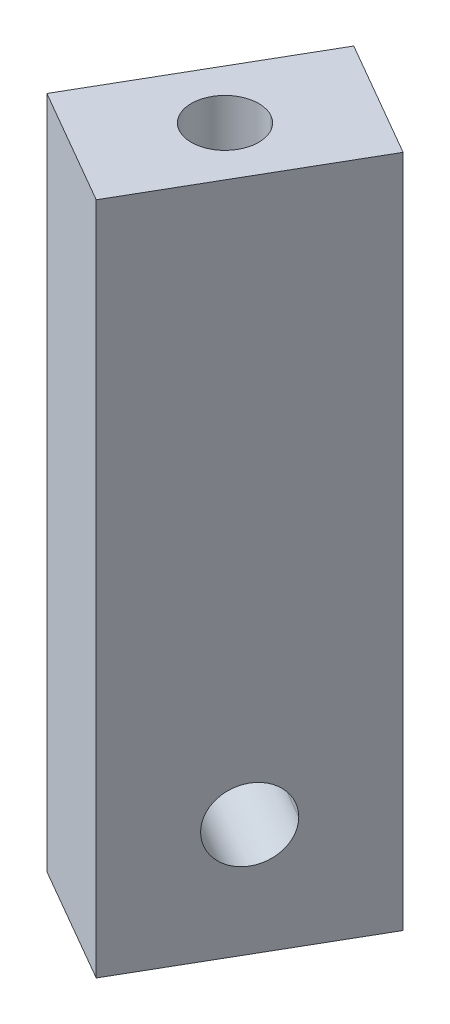
ISO-10303-21;
HEADER;
FILE_DESCRIPTION(('STEP AP214'),'2;1');
FILE_NAME('part.step','',(''),(''),'','','');
FILE_SCHEMA(('AUTOMOTIVE_DESIGN { 1 0 10303 214 1 1 1 1 }'));
ENDSEC;
DATA;
#1=APPLICATION_CONTEXT('core data for automotive mechanical design processes');
#2=APPLICATION_PROTOCOL_DEFINITION('international standard','automotive_design',2000,#1);
#3=PRODUCT_CONTEXT('',#1,'mechanical');
#4=PRODUCT('Part','Part','',(#3));
#5=PRODUCT_RELATED_PRODUCT_CATEGORY('part','',(#4));
#6=PRODUCT_DEFINITION_FORMATION('','',#4);
#7=PRODUCT_DEFINITION_CONTEXT('part definition',#1,'design');
#8=PRODUCT_DEFINITION('design','',#6,#7);
#9=PRODUCT_DEFINITION_SHAPE('','',#8);
#10=(LENGTH_UNIT() NAMED_UNIT(*) SI_UNIT(.MILLI.,.METRE.));
#11=(NAMED_UNIT(*) PLANE_ANGLE_UNIT() SI_UNIT($,.RADIAN.));
#12=(NAMED_UNIT(*) SI_UNIT($,.STERADIAN.) SOLID_ANGLE_UNIT());
#13=UNCERTAINTY_MEASURE_WITH_UNIT(LENGTH_MEASURE(1.E-05),#10,'distance_accuracy_value','');
#14=(GEOMETRIC_REPRESENTATION_CONTEXT(3) GLOBAL_UNCERTAINTY_ASSIGNED_CONTEXT((#13)) GLOBAL_UNIT_ASSIGNED_CONTEXT((#10,
#11,#12)) REPRESENTATION_CONTEXT('',''));
#15=CARTESIAN_POINT('',(0.,0.,0.));
#16=DIRECTION('',(0.,0.,1.));
#17=DIRECTION('',(1.,0.,0.));
#18=AXIS2_PLACEMENT_3D('',#15,#16,#17);
#19=CARTESIAN_POINT('',(-69.9623673877507,376.419245646097,156.984663492636));
#20=DIRECTION('',(0.,1.,0.));
#21=DIRECTION('',(0.866025403784462,0.,0.499999999999959));
#22=AXIS2_PLACEMENT_3D('',#19,#20,#21);
#23=PLANE('',#22);
#24=CARTESIAN_POINT('',(-69.9623673877507,376.419245646097,156.984663492636));
#25=DIRECTION('',(0.,1.,0.));
#26=DIRECTION('',(-0.499999999999959,0.,0.866025403784462));
#27=AXIS2_PLACEMENT_3D('',#24,#25,#26);
#28=CIRCLE('',#27,1.5);
#29=CARTESIAN_POINT('',(-70.7123673877507,376.419245646097,158.283701598313));
#30=VERTEX_POINT('',#29);
#31=CARTESIAN_POINT('',(-69.2123673877508,376.419245646097,155.685625386959));
#32=VERTEX_POINT('',#31);
#33=EDGE_CURVE('E11',#30,#32,#28,.T.);
#34=ORIENTED_EDGE('',*,*,#33,.T.);
#35=CARTESIAN_POINT('',(-69.9623673877507,376.419245646097,156.984663492636));
#36=DIRECTION('',(0.,1.,0.));
#37=DIRECTION('',(-0.499999999999959,0.,0.866025403784462));
#38=AXIS2_PLACEMENT_3D('',#35,#36,#37);
#39=CIRCLE('',#38,1.5);
#40=EDGE_CURVE('E168',#32,#30,#39,.T.);
#41=ORIENTED_EDGE('',*,*,#40,.T.);
#42=EDGE_LOOP('',(#34,#41));
#43=FACE_BOUND('',#42,.T.);
#44=ADVANCED_FACE('F38',(#43),#23,.T.);
#45=CARTESIAN_POINT('',(-69.9623673877507,376.419245646097,156.984663492636));
#46=DIRECTION('',(0.,1.,0.));
#47=DIRECTION('',(-0.499999999999959,0.,0.866025403784462));
#48=AXIS2_PLACEMENT_3D('',#45,#46,#47);
#49=CYLINDRICAL_SURFACE('',#48,1.5);
#50=DIRECTION('',(0.,1.,0.));
#51=VECTOR('',#50,1.);
#52=CARTESIAN_POINT('',(-69.2123673877508,376.419245646097,155.685625386959));
#53=LINE('',#52,#51);
#54=CARTESIAN_POINT('',(-69.212367387751,381.419245646097,155.685625386959));
#55=VERTEX_POINT('',#54);
#56=EDGE_CURVE('E163',#32,#55,#53,.T.);
#57=ORIENTED_EDGE('',*,*,#56,.F.);
#58=ORIENTED_EDGE('',*,*,#33,.F.);
#59=DIRECTION('',(0.,1.,0.));
#60=VECTOR('',#59,1.);
#61=CARTESIAN_POINT('',(-70.7123673877507,376.419245646097,158.283701598313));
#62=LINE('',#61,#60);
#63=CARTESIAN_POINT('',(-70.7123673877508,381.419245646097,158.283701598312));
#64=VERTEX_POINT('',#63);
#65=EDGE_CURVE('E176',#30,#64,#62,.T.);
#66=ORIENTED_EDGE('',*,*,#65,.T.);
#67=CARTESIAN_POINT('',(-69.9623673877509,381.419245646097,156.984663492636));
#68=DIRECTION('',(0.,1.,0.));
#69=DIRECTION('',(-0.499999999999959,0.,0.866025403784462));
#70=AXIS2_PLACEMENT_3D('',#67,#68,#69);
#71=CIRCLE('',#70,1.5);
#72=EDGE_CURVE('E42',#64,#55,#71,.T.);
#73=ORIENTED_EDGE('',*,*,#72,.T.);
#74=EDGE_LOOP('',(#57,#58,#66,#73));
#75=FACE_BOUND('',#74,.T.);
#76=ADVANCED_FACE('F220',(#75),#49,.F.);
#77=CARTESIAN_POINT('',(-67.363425150993,356.419245646097,158.485163492637));
#78=DIRECTION('',(-0.866025403784462,0.,-0.499999999999959));
#79=DIRECTION('',(-0.499999999999959,0.,0.866025403784462));
#80=AXIS2_PLACEMENT_3D('',#77,#78,#79);
#81=CYLINDRICAL_SURFACE('',#80,1.6);
#82=DIRECTION('',(-0.866025403784462,0.,-0.499999999999959));
#83=VECTOR('',#82,1.);
#84=CARTESIAN_POINT('',(-66.563425150993,356.419245646097,157.099522846582));
#85=LINE('',#84,#83);
#86=CARTESIAN_POINT('',(-66.5642911763968,356.419245646097,157.099022846582));
#87=VERTEX_POINT('',#86);
#88=CARTESIAN_POINT('',(-71.7604435991036,356.419245646097,154.099022846583));
#89=VERTEX_POINT('',#88);
#90=EDGE_CURVE('E158',#87,#89,#85,.T.);
#91=ORIENTED_EDGE('',*,*,#90,.F.);
#92=CARTESIAN_POINT('',(-67.3642911763968,356.419245646097,158.484663492637));
#93=DIRECTION('',(0.866025403784462,0.,0.499999999999959));
#94=DIRECTION('',(-0.499999999999959,0.,0.866025403784462));
#95=AXIS2_PLACEMENT_3D('',#92,#93,#94);
#96=CIRCLE('',#95,1.6);
#97=CARTESIAN_POINT('',(-68.1642911763967,356.419245646097,159.870304138693));
#98=VERTEX_POINT('',#97);
#99=EDGE_CURVE('E145',#87,#98,#96,.T.);
#100=ORIENTED_EDGE('',*,*,#99,.T.);
#101=DIRECTION('',(-0.866025403784462,0.,-0.499999999999959));
#102=VECTOR('',#101,1.);
#103=CARTESIAN_POINT('',(-68.1634251509929,356.419245646097,159.870804138693));
#104=LINE('',#103,#102);
#105=CARTESIAN_POINT('',(-73.3604435991035,356.419245646097,156.870304138693));
#106=VERTEX_POINT('',#105);
#107=EDGE_CURVE('E142',#98,#106,#104,.T.);
#108=ORIENTED_EDGE('',*,*,#107,.T.);
#109=CARTESIAN_POINT('',(-72.5604435991035,356.419245646097,155.484663492638));
#110=DIRECTION('',(-0.866025403784462,0.,-0.499999999999959));
#111=DIRECTION('',(-0.499999999999959,0.,0.866025403784462));
#112=AXIS2_PLACEMENT_3D('',#109,#110,#111);
#113=CIRCLE('',#112,1.6);
#114=EDGE_CURVE('E171',#106,#89,#113,.T.);
#115=ORIENTED_EDGE('',*,*,#114,.T.);
#116=EDGE_LOOP('',(#91,#100,#108,#115));
#117=FACE_BOUND('',#116,.T.);
#118=ADVANCED_FACE('F226',(#117),#81,.F.);
#119=CARTESIAN_POINT('',(-69.96236738775,351.419245646097,156.984663492638));
#120=DIRECTION('',(0.,1.,0.));
#121=DIRECTION('',(0.866025403784462,0.,0.499999999999959));
#122=AXIS2_PLACEMENT_3D('',#119,#120,#121);
#123=PLANE('',#122);
#124=DIRECTION('',(-0.499999999999959,0.,0.866025403784462));
#125=VECTOR('',#124,1.);
#126=CARTESIAN_POINT('',(-75.0604435991032,351.419245646097,159.81479051156));
#127=LINE('',#126,#125);
#128=CARTESIAN_POINT('',(-70.0604435991036,351.419245646096,151.154536473716));
#129=VERTEX_POINT('',#128);
#130=CARTESIAN_POINT('',(-75.0604435991032,351.419245646097,159.81479051156));
#131=VERTEX_POINT('',#130);
#132=EDGE_CURVE('E136',#129,#131,#127,.T.);
#133=ORIENTED_EDGE('',*,*,#132,.F.);
#134=DIRECTION('',(-0.866025403784462,0.,-0.499999999999959));
#135=VECTOR('',#134,1.);
#136=CARTESIAN_POINT('',(-64.8642911763968,351.419245646097,154.154536473716));
#137=LINE('',#136,#135);
#138=CARTESIAN_POINT('',(-64.8642911763968,351.419245646097,154.154536473716));
#139=VERTEX_POINT('',#138);
#140=EDGE_CURVE('E147',#139,#129,#137,.T.);
#141=ORIENTED_EDGE('',*,*,#140,.F.);
#142=DIRECTION('',(0.499999999999959,0.,-0.866025403784462));
#143=VECTOR('',#142,1.);
#144=CARTESIAN_POINT('',(-69.8642911763964,351.419245646098,162.81479051156));
#145=LINE('',#144,#143);
#146=CARTESIAN_POINT('',(-69.8642911763964,351.419245646098,162.81479051156));
#147=VERTEX_POINT('',#146);
#148=EDGE_CURVE('E124',#147,#139,#145,.T.);
#149=ORIENTED_EDGE('',*,*,#148,.F.);
#150=DIRECTION('',(0.866025403784462,0.,0.499999999999959));
#151=VECTOR('',#150,1.);
#152=CARTESIAN_POINT('',(-69.8642911763964,351.419245646098,162.81479051156));
#153=LINE('',#152,#151);
#154=EDGE_CURVE('E169',#131,#147,#153,.T.);
#155=ORIENTED_EDGE('',*,*,#154,.F.);
#156=EDGE_LOOP('',(#133,#141,#149,#155));
#157=FACE_BOUND('',#156,.T.);
#158=ADVANCED_FACE('F209',(#157),#123,.F.);
#159=CARTESIAN_POINT('',(-69.9623673877509,381.419245646097,156.984663492636));
#160=DIRECTION('',(0.,1.,0.));
#161=DIRECTION('',(0.866025403784462,0.,0.499999999999959));
#162=AXIS2_PLACEMENT_3D('',#159,#160,#161);
#163=PLANE('',#162);
#164=ORIENTED_EDGE('',*,*,#72,.F.);
#165=CARTESIAN_POINT('',(-69.9623673877509,381.419245646097,156.984663492636));
#166=DIRECTION('',(0.,1.,0.));
#167=DIRECTION('',(-0.499999999999959,0.,0.866025403784462));
#168=AXIS2_PLACEMENT_3D('',#165,#166,#167);
#169=CIRCLE('',#168,1.5);
#170=EDGE_CURVE('E167',#55,#64,#169,.T.);
#171=ORIENTED_EDGE('',*,*,#170,.F.);
#172=EDGE_LOOP('',(#164,#171));
#173=FACE_BOUND('',#172,.T.);
#174=DIRECTION('',(-0.499999999999959,0.,0.866025403784462));
#175=VECTOR('',#174,1.);
#176=CARTESIAN_POINT('',(-75.0604435991041,381.419245646097,159.814790511558));
#177=LINE('',#176,#175);
#178=CARTESIAN_POINT('',(-70.0604435991045,381.419245646097,151.154536473713));
#179=VERTEX_POINT('',#178);
#180=CARTESIAN_POINT('',(-75.0604435991041,381.419245646097,159.814790511558));
#181=VERTEX_POINT('',#180);
#182=EDGE_CURVE('E127',#179,#181,#177,.T.);
#183=ORIENTED_EDGE('',*,*,#182,.T.);
#184=DIRECTION('',(0.866025403784462,0.,0.499999999999959));
#185=VECTOR('',#184,1.);
#186=CARTESIAN_POINT('',(-69.8642911763973,381.419245646097,162.814790511558));
#187=LINE('',#186,#185);
#188=CARTESIAN_POINT('',(-69.8642911763973,381.419245646097,162.814790511558));
#189=VERTEX_POINT('',#188);
#190=EDGE_CURVE('E113',#181,#189,#187,.T.);
#191=ORIENTED_EDGE('',*,*,#190,.T.);
#192=DIRECTION('',(0.499999999999959,0.,-0.866025403784462));
#193=VECTOR('',#192,1.);
#194=CARTESIAN_POINT('',(-69.8642911763973,381.419245646097,162.814790511558));
#195=LINE('',#194,#193);
#196=CARTESIAN_POINT('',(-64.8642911763977,381.419245646097,154.154536473713));
#197=VERTEX_POINT('',#196);
#198=EDGE_CURVE('E148',#189,#197,#195,.T.);
#199=ORIENTED_EDGE('',*,*,#198,.T.);
#200=DIRECTION('',(-0.866025403784462,0.,-0.499999999999959));
#201=VECTOR('',#200,1.);
#202=CARTESIAN_POINT('',(-64.8642911763977,381.419245646097,154.154536473713));
#203=LINE('',#202,#201);
#204=EDGE_CURVE('E61',#197,#179,#203,.T.);
#205=ORIENTED_EDGE('',*,*,#204,.T.);
#206=EDGE_LOOP('',(#183,#191,#199,#205));
#207=FACE_BOUND('',#206,.T.);
#208=ADVANCED_FACE('F128',(#173,#207),#163,.T.);
#209=CARTESIAN_POINT('',(-64.8642911763977,381.419245646097,154.154536473713));
#210=DIRECTION('',(-0.499999999999959,0.,0.866025403784462));
#211=DIRECTION('',(0.866025403784462,0.,0.499999999999959));
#212=AXIS2_PLACEMENT_3D('',#209,#210,#211);
#213=PLANE('',#212);
#214=ORIENTED_EDGE('',*,*,#140,.T.);
#215=DIRECTION('',(0.,-1.,0.));
#216=VECTOR('',#215,1.);
#217=CARTESIAN_POINT('',(-70.0604435991045,381.419245646097,151.154536473713));
#218=LINE('',#217,#216);
#219=EDGE_CURVE('E132',#179,#129,#218,.T.);
#220=ORIENTED_EDGE('',*,*,#219,.F.);
#221=ORIENTED_EDGE('',*,*,#204,.F.);
#222=DIRECTION('',(0.,-1.,0.));
#223=VECTOR('',#222,1.);
#224=CARTESIAN_POINT('',(-64.8642911763977,381.419245646097,154.154536473713));
#225=LINE('',#224,#223);
#226=EDGE_CURVE('E155',#197,#139,#225,.T.);
#227=ORIENTED_EDGE('',*,*,#226,.T.);
#228=EDGE_LOOP('',(#214,#220,#221,#227));
#229=FACE_BOUND('',#228,.T.);
#230=ADVANCED_FACE('F40',(#229),#213,.F.);
#231=CARTESIAN_POINT('',(-69.8642911763973,381.419245646097,162.814790511558));
#232=DIRECTION('',(-0.866025403784462,0.,-0.499999999999959));
#233=DIRECTION('',(0.,1.,0.));
#234=AXIS2_PLACEMENT_3D('',#231,#232,#233);
#235=PLANE('',#234);
#236=CARTESIAN_POINT('',(-67.3642911763968,356.419245646097,158.484663492637));
#237=DIRECTION('',(0.866025403784462,0.,0.499999999999959));
#238=DIRECTION('',(-0.499999999999959,0.,0.866025403784462));
#239=AXIS2_PLACEMENT_3D('',#236,#237,#238);
#240=CIRCLE('',#239,1.6);
#241=EDGE_CURVE('E162',#98,#87,#240,.T.);
#242=ORIENTED_EDGE('',*,*,#241,.F.);
#243=ORIENTED_EDGE('',*,*,#99,.F.);
#244=EDGE_LOOP('',(#242,#243));
#245=FACE_BOUND('',#244,.T.);
#246=ORIENTED_EDGE('',*,*,#148,.T.);
#247=ORIENTED_EDGE('',*,*,#226,.F.);
#248=ORIENTED_EDGE('',*,*,#198,.F.);
#249=DIRECTION('',(0.,-1.,0.));
#250=VECTOR('',#249,1.);
#251=CARTESIAN_POINT('',(-69.8642911763973,381.419245646097,162.814790511558));
#252=LINE('',#251,#250);
#253=EDGE_CURVE('E121',#189,#147,#252,.T.);
#254=ORIENTED_EDGE('',*,*,#253,.T.);
#255=EDGE_LOOP('',(#246,#247,#248,#254));
#256=FACE_BOUND('',#255,.T.);
#257=ADVANCED_FACE('F206',(#245,#256),#235,.F.);
#258=CARTESIAN_POINT('',(-69.8642911763973,381.419245646097,162.814790511558));
#259=DIRECTION('',(0.499999999999959,0.,-0.866025403784462));
#260=DIRECTION('',(0.,-1.,0.));
#261=AXIS2_PLACEMENT_3D('',#258,#259,#260);
#262=PLANE('',#261);
#263=ORIENTED_EDGE('',*,*,#154,.T.);
#264=ORIENTED_EDGE('',*,*,#253,.F.);
#265=ORIENTED_EDGE('',*,*,#190,.F.);
#266=DIRECTION('',(0.,-1.,0.));
#267=VECTOR('',#266,1.);
#268=CARTESIAN_POINT('',(-75.0604435991041,381.419245646097,159.814790511558));
#269=LINE('',#268,#267);
#270=EDGE_CURVE('E118',#181,#131,#269,.T.);
#271=ORIENTED_EDGE('',*,*,#270,.T.);
#272=EDGE_LOOP('',(#263,#264,#265,#271));
#273=FACE_BOUND('',#272,.T.);
#274=ADVANCED_FACE('F116',(#273),#262,.F.);
#275=CARTESIAN_POINT('',(-75.0604435991041,381.419245646097,159.814790511558));
#276=DIRECTION('',(0.866025403784462,0.,0.499999999999959));
#277=DIRECTION('',(0.499999999999959,0.,-0.866025403784462));
#278=AXIS2_PLACEMENT_3D('',#275,#276,#277);
#279=PLANE('',#278);
#280=ORIENTED_EDGE('',*,*,#114,.F.);
#281=CARTESIAN_POINT('',(-72.5604435991035,356.419245646097,155.484663492638));
#282=DIRECTION('',(-0.866025403784462,0.,-0.499999999999959));
#283=DIRECTION('',(-0.499999999999959,0.,0.866025403784462));
#284=AXIS2_PLACEMENT_3D('',#281,#282,#283);
#285=CIRCLE('',#284,1.6);
#286=EDGE_CURVE('E152',#89,#106,#285,.T.);
#287=ORIENTED_EDGE('',*,*,#286,.F.);
#288=EDGE_LOOP('',(#280,#287));
#289=FACE_BOUND('',#288,.T.);
#290=ORIENTED_EDGE('',*,*,#132,.T.);
#291=ORIENTED_EDGE('',*,*,#270,.F.);
#292=ORIENTED_EDGE('',*,*,#182,.F.);
#293=ORIENTED_EDGE('',*,*,#219,.T.);
#294=EDGE_LOOP('',(#290,#291,#292,#293));
#295=FACE_BOUND('',#294,.T.);
#296=ADVANCED_FACE('F134',(#289,#295),#279,.F.);
#297=CARTESIAN_POINT('',(-67.363425150993,356.419245646097,158.485163492637));
#298=DIRECTION('',(-0.866025403784462,0.,-0.499999999999959));
#299=DIRECTION('',(-0.499999999999959,0.,0.866025403784462));
#300=AXIS2_PLACEMENT_3D('',#297,#298,#299);
#301=CYLINDRICAL_SURFACE('',#300,1.6);
#302=ORIENTED_EDGE('',*,*,#241,.T.);
#303=ORIENTED_EDGE('',*,*,#90,.T.);
#304=ORIENTED_EDGE('',*,*,#286,.T.);
#305=ORIENTED_EDGE('',*,*,#107,.F.);
#306=EDGE_LOOP('',(#302,#303,#304,#305));
#307=FACE_BOUND('',#306,.T.);
#308=ADVANCED_FACE('F230',(#307),#301,.F.);
#309=CARTESIAN_POINT('',(-69.9623673877507,376.419245646097,156.984663492636));
#310=DIRECTION('',(0.,1.,0.));
#311=DIRECTION('',(-0.499999999999959,0.,0.866025403784462));
#312=AXIS2_PLACEMENT_3D('',#309,#310,#311);
#313=CYLINDRICAL_SURFACE('',#312,1.5);
#314=ORIENTED_EDGE('',*,*,#40,.F.);
#315=ORIENTED_EDGE('',*,*,#56,.T.);
#316=ORIENTED_EDGE('',*,*,#170,.T.);
#317=ORIENTED_EDGE('',*,*,#65,.F.);
#318=EDGE_LOOP('',(#314,#315,#316,#317));
#319=FACE_BOUND('',#318,.T.);
#320=ADVANCED_FACE('F233',(#319),#313,.F.);
#321=CLOSED_SHELL('',(#44,#76,#118,#158,#208,#230,#257,#274,#296,#308,#320));
#322=MANIFOLD_SOLID_BREP('B2',#321);
#323=ADVANCED_BREP_SHAPE_REPRESENTATION('',(#18,#322),#14);
#324=SHAPE_DEFINITION_REPRESENTATION(#9,#323);
ENDSEC;
END-ISO-10303-21;
